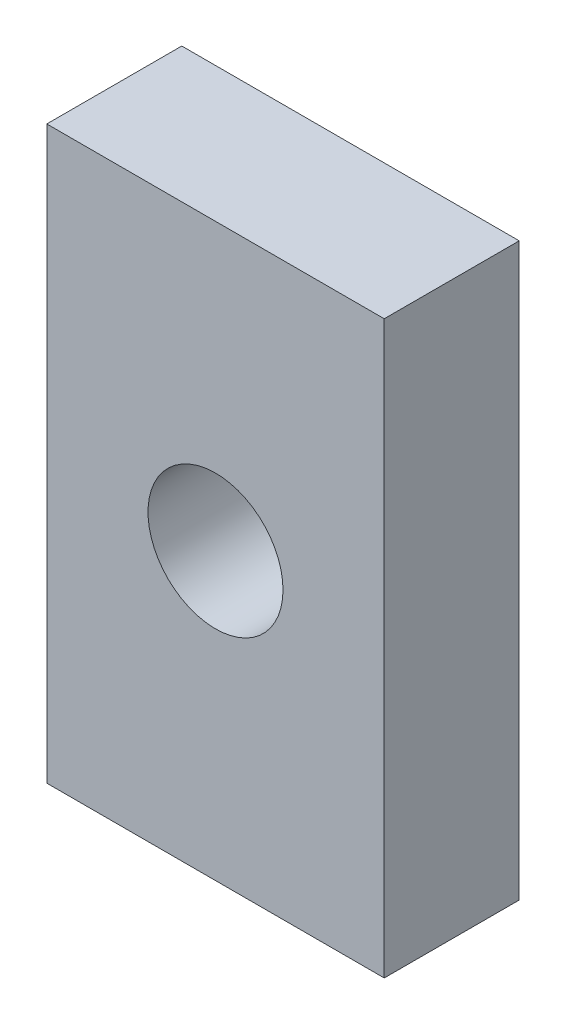
ISO-10303-21;
HEADER;
FILE_DESCRIPTION(('STEP AP214'),'2;1');
FILE_NAME('part.step','',(''),(''),'','','');
FILE_SCHEMA(('AUTOMOTIVE_DESIGN { 1 0 10303 214 1 1 1 1 }'));
ENDSEC;
DATA;
#1=APPLICATION_CONTEXT('core data for automotive mechanical design processes');
#2=APPLICATION_PROTOCOL_DEFINITION('international standard','automotive_design',2000,#1);
#3=PRODUCT_CONTEXT('',#1,'mechanical');
#4=PRODUCT('Part','Part','',(#3));
#5=PRODUCT_RELATED_PRODUCT_CATEGORY('part','',(#4));
#6=PRODUCT_DEFINITION_FORMATION('','',#4);
#7=PRODUCT_DEFINITION_CONTEXT('part definition',#1,'design');
#8=PRODUCT_DEFINITION('design','',#6,#7);
#9=PRODUCT_DEFINITION_SHAPE('','',#8);
#10=(LENGTH_UNIT() NAMED_UNIT(*) SI_UNIT(.MILLI.,.METRE.));
#11=(NAMED_UNIT(*) PLANE_ANGLE_UNIT() SI_UNIT($,.RADIAN.));
#12=(NAMED_UNIT(*) SI_UNIT($,.STERADIAN.) SOLID_ANGLE_UNIT());
#13=UNCERTAINTY_MEASURE_WITH_UNIT(LENGTH_MEASURE(1.E-05),#10,'distance_accuracy_value','');
#14=(GEOMETRIC_REPRESENTATION_CONTEXT(3) GLOBAL_UNCERTAINTY_ASSIGNED_CONTEXT((#13)) GLOBAL_UNIT_ASSIGNED_CONTEXT((#10,
#11,#12)) REPRESENTATION_CONTEXT('',''));
#15=CARTESIAN_POINT('',(0.,0.,0.));
#16=DIRECTION('',(0.,0.,1.));
#17=DIRECTION('',(1.,0.,0.));
#18=AXIS2_PLACEMENT_3D('',#15,#16,#17);
#19=CARTESIAN_POINT('',(0.,0.,10.));
#20=DIRECTION('',(0.,0.,-1.));
#21=DIRECTION('',(-1.,0.,0.));
#22=AXIS2_PLACEMENT_3D('',#19,#20,#21);
#23=PLANE('',#22);
#24=DIRECTION('',(0.,1.,0.));
#25=VECTOR('',#24,1.);
#26=CARTESIAN_POINT('',(12.5,-21.15,10.));
#27=LINE('',#26,#25);
#28=CARTESIAN_POINT('',(12.5,-21.15,10.));
#29=VERTEX_POINT('',#28);
#30=CARTESIAN_POINT('',(12.5,21.15,10.));
#31=VERTEX_POINT('',#30);
#32=EDGE_CURVE('E85',#29,#31,#27,.T.);
#33=ORIENTED_EDGE('',*,*,#32,.T.);
#34=DIRECTION('',(-1.,0.,0.));
#35=VECTOR('',#34,1.);
#36=CARTESIAN_POINT('',(-12.5,21.15,10.));
#37=LINE('',#36,#35);
#38=CARTESIAN_POINT('',(-12.5,21.15,10.));
#39=VERTEX_POINT('',#38);
#40=EDGE_CURVE('E80',#31,#39,#37,.T.);
#41=ORIENTED_EDGE('',*,*,#40,.T.);
#42=DIRECTION('',(0.,-1.,0.));
#43=VECTOR('',#42,1.);
#44=CARTESIAN_POINT('',(-12.5,-21.15,10.));
#45=LINE('',#44,#43);
#46=CARTESIAN_POINT('',(-12.5,-21.15,10.));
#47=VERTEX_POINT('',#46);
#48=EDGE_CURVE('E83',#39,#47,#45,.T.);
#49=ORIENTED_EDGE('',*,*,#48,.T.);
#50=DIRECTION('',(1.,0.,0.));
#51=VECTOR('',#50,1.);
#52=CARTESIAN_POINT('',(-12.5,-21.15,10.));
#53=LINE('',#52,#51);
#54=EDGE_CURVE('E50',#47,#29,#53,.T.);
#55=ORIENTED_EDGE('',*,*,#54,.T.);
#56=EDGE_LOOP('',(#33,#41,#49,#55));
#57=FACE_BOUND('',#56,.T.);
#58=CARTESIAN_POINT('',(0.,0.,10.));
#59=DIRECTION('',(0.,0.,1.));
#60=DIRECTION('',(1.,0.,0.));
#61=AXIS2_PLACEMENT_3D('',#58,#59,#60);
#62=CIRCLE('',#61,5.);
#63=CARTESIAN_POINT('',(5.,0.,10.));
#64=VERTEX_POINT('',#63);
#65=EDGE_CURVE('E100',#64,#64,#62,.T.);
#66=ORIENTED_EDGE('',*,*,#65,.F.);
#67=EDGE_LOOP('',(#66));
#68=FACE_BOUND('',#67,.T.);
#69=ADVANCED_FACE('F33',(#57,#68),#23,.F.);
#70=CARTESIAN_POINT('',(0.,0.,0.));
#71=DIRECTION('',(0.,0.,-1.));
#72=DIRECTION('',(-1.,0.,0.));
#73=AXIS2_PLACEMENT_3D('',#70,#71,#72);
#74=PLANE('',#73);
#75=DIRECTION('',(0.,1.,0.));
#76=VECTOR('',#75,1.);
#77=CARTESIAN_POINT('',(12.5,-21.15,0.));
#78=LINE('',#77,#76);
#79=CARTESIAN_POINT('',(12.5,-21.15,0.));
#80=VERTEX_POINT('',#79);
#81=CARTESIAN_POINT('',(12.5,21.15,0.));
#82=VERTEX_POINT('',#81);
#83=EDGE_CURVE('E97',#80,#82,#78,.T.);
#84=ORIENTED_EDGE('',*,*,#83,.F.);
#85=DIRECTION('',(1.,0.,0.));
#86=VECTOR('',#85,1.);
#87=CARTESIAN_POINT('',(-12.5,-21.15,0.));
#88=LINE('',#87,#86);
#89=CARTESIAN_POINT('',(-12.5,-21.15,0.));
#90=VERTEX_POINT('',#89);
#91=EDGE_CURVE('E73',#90,#80,#88,.T.);
#92=ORIENTED_EDGE('',*,*,#91,.F.);
#93=DIRECTION('',(0.,-1.,0.));
#94=VECTOR('',#93,1.);
#95=CARTESIAN_POINT('',(-12.5,-21.15,0.));
#96=LINE('',#95,#94);
#97=CARTESIAN_POINT('',(-12.5,21.15,0.));
#98=VERTEX_POINT('',#97);
#99=EDGE_CURVE('E67',#98,#90,#96,.T.);
#100=ORIENTED_EDGE('',*,*,#99,.F.);
#101=DIRECTION('',(-1.,0.,0.));
#102=VECTOR('',#101,1.);
#103=CARTESIAN_POINT('',(-12.5,21.15,0.));
#104=LINE('',#103,#102);
#105=EDGE_CURVE('E89',#82,#98,#104,.T.);
#106=ORIENTED_EDGE('',*,*,#105,.F.);
#107=EDGE_LOOP('',(#84,#92,#100,#106));
#108=FACE_BOUND('',#107,.T.);
#109=CARTESIAN_POINT('',(0.,0.,0.));
#110=DIRECTION('',(0.,0.,1.));
#111=DIRECTION('',(1.,0.,0.));
#112=AXIS2_PLACEMENT_3D('',#109,#110,#111);
#113=CIRCLE('',#112,5.);
#114=CARTESIAN_POINT('',(5.,0.,0.));
#115=VERTEX_POINT('',#114);
#116=EDGE_CURVE('E112',#115,#115,#113,.T.);
#117=ORIENTED_EDGE('',*,*,#116,.T.);
#118=EDGE_LOOP('',(#117));
#119=FACE_BOUND('',#118,.T.);
#120=ADVANCED_FACE('F108',(#108,#119),#74,.T.);
#121=CARTESIAN_POINT('',(12.5,-21.15,10.));
#122=DIRECTION('',(-1.,0.,0.));
#123=DIRECTION('',(0.,0.,1.));
#124=AXIS2_PLACEMENT_3D('',#121,#122,#123);
#125=PLANE('',#124);
#126=ORIENTED_EDGE('',*,*,#83,.T.);
#127=DIRECTION('',(0.,0.,-1.));
#128=VECTOR('',#127,1.);
#129=CARTESIAN_POINT('',(12.5,21.15,10.));
#130=LINE('',#129,#128);
#131=EDGE_CURVE('E11',#31,#82,#130,.T.);
#132=ORIENTED_EDGE('',*,*,#131,.F.);
#133=ORIENTED_EDGE('',*,*,#32,.F.);
#134=DIRECTION('',(0.,0.,-1.));
#135=VECTOR('',#134,1.);
#136=CARTESIAN_POINT('',(12.5,-21.15,10.));
#137=LINE('',#136,#135);
#138=EDGE_CURVE('E93',#29,#80,#137,.T.);
#139=ORIENTED_EDGE('',*,*,#138,.T.);
#140=EDGE_LOOP('',(#126,#132,#133,#139));
#141=FACE_BOUND('',#140,.T.);
#142=ADVANCED_FACE('F35',(#141),#125,.F.);
#143=CARTESIAN_POINT('',(-12.5,21.15,10.));
#144=DIRECTION('',(0.,-1.,0.));
#145=DIRECTION('',(0.,0.,-1.));
#146=AXIS2_PLACEMENT_3D('',#143,#144,#145);
#147=PLANE('',#146);
#148=ORIENTED_EDGE('',*,*,#105,.T.);
#149=DIRECTION('',(0.,0.,-1.));
#150=VECTOR('',#149,1.);
#151=CARTESIAN_POINT('',(-12.5,21.15,10.));
#152=LINE('',#151,#150);
#153=EDGE_CURVE('E42',#39,#98,#152,.T.);
#154=ORIENTED_EDGE('',*,*,#153,.F.);
#155=ORIENTED_EDGE('',*,*,#40,.F.);
#156=ORIENTED_EDGE('',*,*,#131,.T.);
#157=EDGE_LOOP('',(#148,#154,#155,#156));
#158=FACE_BOUND('',#157,.T.);
#159=ADVANCED_FACE('F88',(#158),#147,.F.);
#160=CARTESIAN_POINT('',(-12.5,-21.15,10.));
#161=DIRECTION('',(1.,0.,0.));
#162=DIRECTION('',(0.,0.,-1.));
#163=AXIS2_PLACEMENT_3D('',#160,#161,#162);
#164=PLANE('',#163);
#165=ORIENTED_EDGE('',*,*,#99,.T.);
#166=DIRECTION('',(0.,0.,-1.));
#167=VECTOR('',#166,1.);
#168=CARTESIAN_POINT('',(-12.5,-21.15,10.));
#169=LINE('',#168,#167);
#170=EDGE_CURVE('E90',#47,#90,#169,.T.);
#171=ORIENTED_EDGE('',*,*,#170,.F.);
#172=ORIENTED_EDGE('',*,*,#48,.F.);
#173=ORIENTED_EDGE('',*,*,#153,.T.);
#174=EDGE_LOOP('',(#165,#171,#172,#173));
#175=FACE_BOUND('',#174,.T.);
#176=ADVANCED_FACE('F91',(#175),#164,.F.);
#177=CARTESIAN_POINT('',(-12.5,-21.15,10.));
#178=DIRECTION('',(0.,1.,0.));
#179=DIRECTION('',(0.,0.,1.));
#180=AXIS2_PLACEMENT_3D('',#177,#178,#179);
#181=PLANE('',#180);
#182=ORIENTED_EDGE('',*,*,#91,.T.);
#183=ORIENTED_EDGE('',*,*,#138,.F.);
#184=ORIENTED_EDGE('',*,*,#54,.F.);
#185=ORIENTED_EDGE('',*,*,#170,.T.);
#186=EDGE_LOOP('',(#182,#183,#184,#185));
#187=FACE_BOUND('',#186,.T.);
#188=ADVANCED_FACE('F105',(#187),#181,.F.);
#189=CARTESIAN_POINT('',(0.,0.,10.));
#190=DIRECTION('',(0.,0.,-1.));
#191=DIRECTION('',(-1.,0.,0.));
#192=AXIS2_PLACEMENT_3D('',#189,#190,#191);
#193=CYLINDRICAL_SURFACE('',#192,5.);
#194=ORIENTED_EDGE('',*,*,#65,.T.);
#195=EDGE_LOOP('',(#194));
#196=FACE_BOUND('',#195,.T.);
#197=ORIENTED_EDGE('',*,*,#116,.F.);
#198=EDGE_LOOP('',(#197));
#199=FACE_BOUND('',#198,.T.);
#200=ADVANCED_FACE('F118',(#196,#199),#193,.F.);
#201=CLOSED_SHELL('',(#69,#120,#142,#159,#176,#188,#200));
#202=MANIFOLD_SOLID_BREP('B2',#201);
#203=ADVANCED_BREP_SHAPE_REPRESENTATION('',(#18,#202),#14);
#204=SHAPE_DEFINITION_REPRESENTATION(#9,#203);
ENDSEC;
END-ISO-10303-21;
